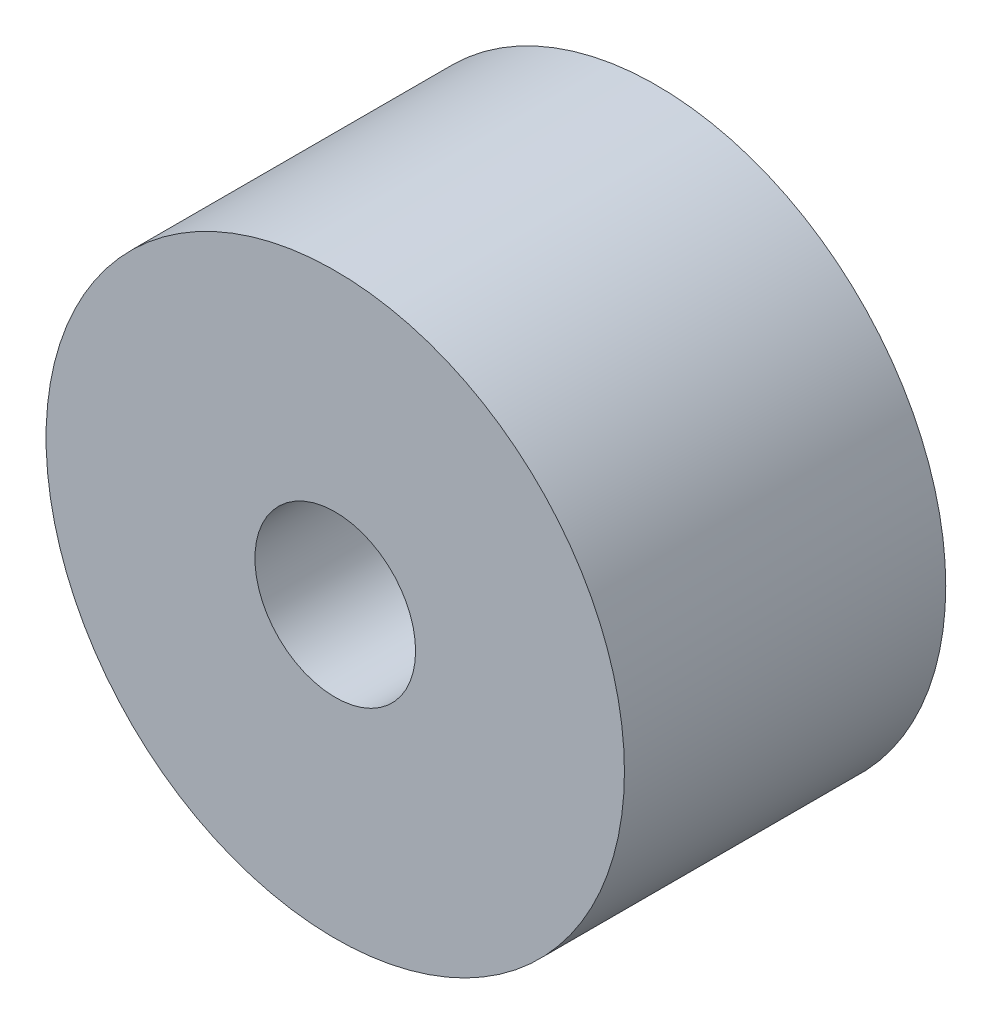
ISO-10303-21;
HEADER;
FILE_DESCRIPTION(('STEP AP214'),'2;1');
FILE_NAME('part.step','',(''),(''),'','','');
FILE_SCHEMA(('AUTOMOTIVE_DESIGN { 1 0 10303 214 1 1 1 1 }'));
ENDSEC;
DATA;
#1=APPLICATION_CONTEXT('core data for automotive mechanical design processes');
#2=APPLICATION_PROTOCOL_DEFINITION('international standard','automotive_design',2000,#1);
#3=PRODUCT_CONTEXT('',#1,'mechanical');
#4=PRODUCT('Part','Part','',(#3));
#5=PRODUCT_RELATED_PRODUCT_CATEGORY('part','',(#4));
#6=PRODUCT_DEFINITION_FORMATION('','',#4);
#7=PRODUCT_DEFINITION_CONTEXT('part definition',#1,'design');
#8=PRODUCT_DEFINITION('design','',#6,#7);
#9=PRODUCT_DEFINITION_SHAPE('','',#8);
#10=(LENGTH_UNIT() NAMED_UNIT(*) SI_UNIT(.MILLI.,.METRE.));
#11=(NAMED_UNIT(*) PLANE_ANGLE_UNIT() SI_UNIT($,.RADIAN.));
#12=(NAMED_UNIT(*) SI_UNIT($,.STERADIAN.) SOLID_ANGLE_UNIT());
#13=UNCERTAINTY_MEASURE_WITH_UNIT(LENGTH_MEASURE(1.E-05),#10,'distance_accuracy_value','');
#14=(GEOMETRIC_REPRESENTATION_CONTEXT(3) GLOBAL_UNCERTAINTY_ASSIGNED_CONTEXT((#13)) GLOBAL_UNIT_ASSIGNED_CONTEXT((#10,
#11,#12)) REPRESENTATION_CONTEXT('',''));
#15=CARTESIAN_POINT('',(0.,0.,0.));
#16=DIRECTION('',(0.,0.,1.));
#17=DIRECTION('',(1.,0.,0.));
#18=AXIS2_PLACEMENT_3D('',#15,#16,#17);
#19=CARTESIAN_POINT('',(0.,0.,20.));
#20=DIRECTION('',(0.,0.,-1.));
#21=DIRECTION('',(-1.,0.,0.));
#22=AXIS2_PLACEMENT_3D('',#19,#20,#21);
#23=CYLINDRICAL_SURFACE('',#22,18.);
#24=CARTESIAN_POINT('',(0.,0.,20.));
#25=DIRECTION('',(0.,0.,1.));
#26=DIRECTION('',(1.,0.,0.));
#27=AXIS2_PLACEMENT_3D('',#24,#25,#26);
#28=CIRCLE('',#27,18.);
#29=CARTESIAN_POINT('',(18.,0.,20.));
#30=VERTEX_POINT('',#29);
#31=EDGE_CURVE('E10',#30,#30,#28,.T.);
#32=ORIENTED_EDGE('',*,*,#31,.F.);
#33=EDGE_LOOP('',(#32));
#34=FACE_BOUND('',#33,.T.);
#35=CARTESIAN_POINT('',(0.,0.,0.));
#36=DIRECTION('',(0.,0.,1.));
#37=DIRECTION('',(1.,0.,0.));
#38=AXIS2_PLACEMENT_3D('',#35,#36,#37);
#39=CIRCLE('',#38,18.);
#40=CARTESIAN_POINT('',(18.,0.,0.));
#41=VERTEX_POINT('',#40);
#42=EDGE_CURVE('E37',#41,#41,#39,.T.);
#43=ORIENTED_EDGE('',*,*,#42,.T.);
#44=EDGE_LOOP('',(#43));
#45=FACE_BOUND('',#44,.T.);
#46=ADVANCED_FACE('F40',(#34,#45),#23,.T.);
#47=CARTESIAN_POINT('',(0.,0.,20.));
#48=DIRECTION('',(0.,0.,1.));
#49=DIRECTION('',(1.,0.,0.));
#50=AXIS2_PLACEMENT_3D('',#47,#48,#49);
#51=PLANE('',#50);
#52=CARTESIAN_POINT('',(0.,0.,20.));
#53=DIRECTION('',(0.,0.,1.));
#54=DIRECTION('',(1.,0.,0.));
#55=AXIS2_PLACEMENT_3D('',#52,#53,#54);
#56=CIRCLE('',#55,5.);
#57=CARTESIAN_POINT('',(5.,0.,20.));
#58=VERTEX_POINT('',#57);
#59=EDGE_CURVE('E50',#58,#58,#56,.T.);
#60=ORIENTED_EDGE('',*,*,#59,.F.);
#61=EDGE_LOOP('',(#60));
#62=FACE_BOUND('',#61,.T.);
#63=ORIENTED_EDGE('',*,*,#31,.T.);
#64=EDGE_LOOP('',(#63));
#65=FACE_BOUND('',#64,.T.);
#66=ADVANCED_FACE('F59',(#62,#65),#51,.T.);
#67=CARTESIAN_POINT('',(0.,0.,0.));
#68=DIRECTION('',(0.,0.,1.));
#69=DIRECTION('',(1.,0.,0.));
#70=AXIS2_PLACEMENT_3D('',#67,#68,#69);
#71=PLANE('',#70);
#72=CARTESIAN_POINT('',(0.,0.,0.));
#73=DIRECTION('',(0.,0.,1.));
#74=DIRECTION('',(1.,0.,0.));
#75=AXIS2_PLACEMENT_3D('',#72,#73,#74);
#76=CIRCLE('',#75,5.);
#77=CARTESIAN_POINT('',(5.,0.,0.));
#78=VERTEX_POINT('',#77);
#79=EDGE_CURVE('E47',#78,#78,#76,.T.);
#80=ORIENTED_EDGE('',*,*,#79,.T.);
#81=EDGE_LOOP('',(#80));
#82=FACE_BOUND('',#81,.T.);
#83=ORIENTED_EDGE('',*,*,#42,.F.);
#84=EDGE_LOOP('',(#83));
#85=FACE_BOUND('',#84,.T.);
#86=ADVANCED_FACE('F58',(#82,#85),#71,.F.);
#87=CARTESIAN_POINT('',(0.,0.,20.));
#88=DIRECTION('',(0.,0.,-1.));
#89=DIRECTION('',(-1.,0.,0.));
#90=AXIS2_PLACEMENT_3D('',#87,#88,#89);
#91=CYLINDRICAL_SURFACE('',#90,5.);
#92=ORIENTED_EDGE('',*,*,#59,.T.);
#93=EDGE_LOOP('',(#92));
#94=FACE_BOUND('',#93,.T.);
#95=ORIENTED_EDGE('',*,*,#79,.F.);
#96=EDGE_LOOP('',(#95));
#97=FACE_BOUND('',#96,.T.);
#98=ADVANCED_FACE('F54',(#94,#97),#91,.F.);
#99=CLOSED_SHELL('',(#46,#66,#86,#98));
#100=MANIFOLD_SOLID_BREP('B2',#99);
#101=ADVANCED_BREP_SHAPE_REPRESENTATION('',(#18,#100),#14);
#102=SHAPE_DEFINITION_REPRESENTATION(#9,#101);
ENDSEC;
END-ISO-10303-21;
